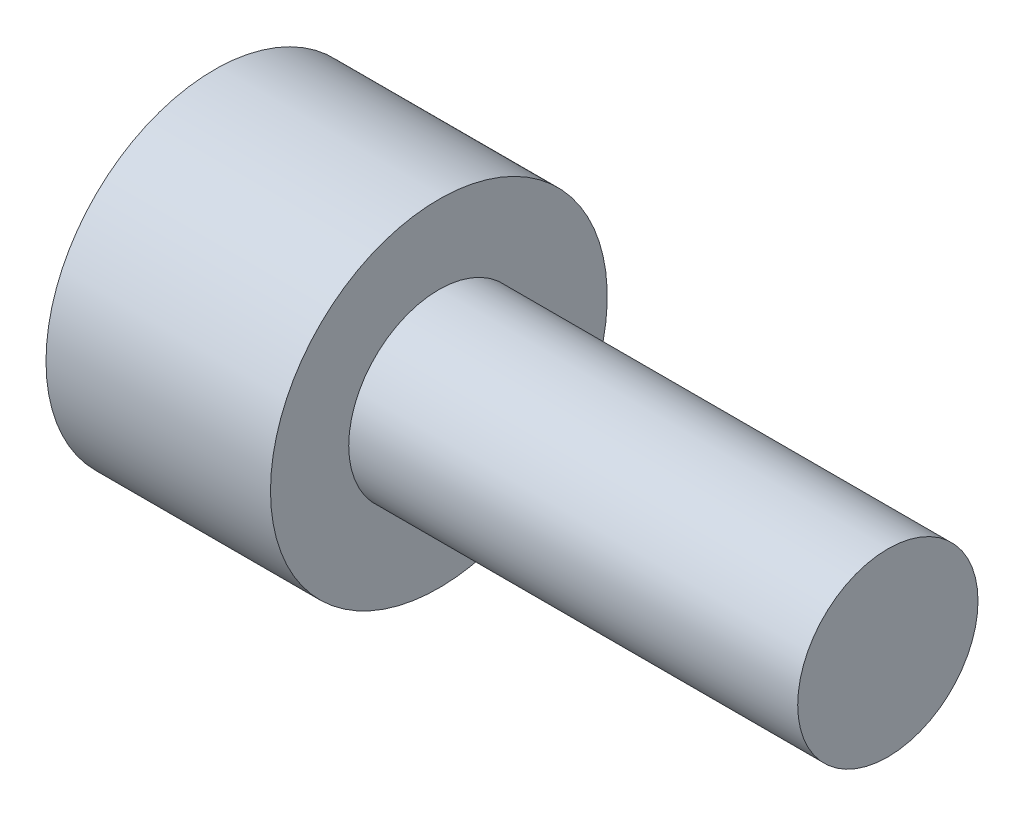
ISO-10303-21;
HEADER;
FILE_DESCRIPTION(('STEP AP214'),'2;1');
FILE_NAME('part.step','',(''),(''),'','','');
FILE_SCHEMA(('AUTOMOTIVE_DESIGN { 1 0 10303 214 1 1 1 1 }'));
ENDSEC;
DATA;
#1=APPLICATION_CONTEXT('core data for automotive mechanical design processes');
#2=APPLICATION_PROTOCOL_DEFINITION('international standard','automotive_design',2000,#1);
#3=PRODUCT_CONTEXT('',#1,'mechanical');
#4=PRODUCT('Part','Part','',(#3));
#5=PRODUCT_RELATED_PRODUCT_CATEGORY('part','',(#4));
#6=PRODUCT_DEFINITION_FORMATION('','',#4);
#7=PRODUCT_DEFINITION_CONTEXT('part definition',#1,'design');
#8=PRODUCT_DEFINITION('design','',#6,#7);
#9=PRODUCT_DEFINITION_SHAPE('','',#8);
#10=(LENGTH_UNIT() NAMED_UNIT(*) SI_UNIT(.MILLI.,.METRE.));
#11=(NAMED_UNIT(*) PLANE_ANGLE_UNIT() SI_UNIT($,.RADIAN.));
#12=(NAMED_UNIT(*) SI_UNIT($,.STERADIAN.) SOLID_ANGLE_UNIT());
#13=UNCERTAINTY_MEASURE_WITH_UNIT(LENGTH_MEASURE(1.E-05),#10,'distance_accuracy_value','');
#14=(GEOMETRIC_REPRESENTATION_CONTEXT(3) GLOBAL_UNCERTAINTY_ASSIGNED_CONTEXT((#13)) GLOBAL_UNIT_ASSIGNED_CONTEXT((#10,
#11,#12)) REPRESENTATION_CONTEXT('',''));
#15=CARTESIAN_POINT('',(0.,0.,0.));
#16=DIRECTION('',(0.,0.,1.));
#17=DIRECTION('',(1.,0.,0.));
#18=AXIS2_PLACEMENT_3D('',#15,#16,#17);
#19=CARTESIAN_POINT('',(-6.35,0.,0.));
#20=DIRECTION('',(1.,0.,0.));
#21=DIRECTION('',(0.,0.,-1.));
#22=AXIS2_PLACEMENT_3D('',#19,#20,#21);
#23=PLANE('',#22);
#24=CARTESIAN_POINT('',(-6.34999999999997,0.,0.));
#25=DIRECTION('',(-1.,0.,0.));
#26=DIRECTION('',(0.,0.,1.));
#27=AXIS2_PLACEMENT_3D('',#24,#25,#26);
#28=CIRCLE('',#27,4.7625);
#29=CARTESIAN_POINT('',(-6.34999999999997,0.,4.7625));
#30=VERTEX_POINT('',#29);
#31=EDGE_CURVE('E11',#30,#30,#28,.T.);
#32=ORIENTED_EDGE('',*,*,#31,.T.);
#33=EDGE_LOOP('',(#32));
#34=FACE_BOUND('',#33,.T.);
#35=DIRECTION('',(0.,0.866025403784439,-0.5));
#36=VECTOR('',#35,1.);
#37=CARTESIAN_POINT('',(-6.35,-2.38,-1.37409364067131));
#38=LINE('',#37,#36);
#39=CARTESIAN_POINT('',(-6.35,-2.38,-1.37409364067131));
#40=VERTEX_POINT('',#39);
#41=CARTESIAN_POINT('',(-6.35,0.,-2.74818728134262));
#42=VERTEX_POINT('',#41);
#43=EDGE_CURVE('E54',#40,#42,#38,.T.);
#44=ORIENTED_EDGE('',*,*,#43,.T.);
#45=DIRECTION('',(0.,0.866025403784439,0.5));
#46=VECTOR('',#45,1.);
#47=CARTESIAN_POINT('',(-6.35,0.,-2.74818728134262));
#48=LINE('',#47,#46);
#49=CARTESIAN_POINT('',(-6.35,2.38,-1.37409364067131));
#50=VERTEX_POINT('',#49);
#51=EDGE_CURVE('E127',#42,#50,#48,.T.);
#52=ORIENTED_EDGE('',*,*,#51,.T.);
#53=DIRECTION('',(0.,0.,1.));
#54=VECTOR('',#53,1.);
#55=CARTESIAN_POINT('',(-6.35,2.38,-1.37409364067131));
#56=LINE('',#55,#54);
#57=CARTESIAN_POINT('',(-6.35,2.38,1.37409364067131));
#58=VERTEX_POINT('',#57);
#59=EDGE_CURVE('E129',#50,#58,#56,.T.);
#60=ORIENTED_EDGE('',*,*,#59,.T.);
#61=DIRECTION('',(0.,-0.866025403784439,0.5));
#62=VECTOR('',#61,1.);
#63=CARTESIAN_POINT('',(-6.35,2.38,1.37409364067131));
#64=LINE('',#63,#62);
#65=CARTESIAN_POINT('',(-6.35,0.,2.74818728134262));
#66=VERTEX_POINT('',#65);
#67=EDGE_CURVE('E134',#58,#66,#64,.T.);
#68=ORIENTED_EDGE('',*,*,#67,.T.);
#69=DIRECTION('',(0.,-0.866025403784439,-0.5));
#70=VECTOR('',#69,1.);
#71=CARTESIAN_POINT('',(-6.35,0.,2.74818728134262));
#72=LINE('',#71,#70);
#73=CARTESIAN_POINT('',(-6.35,-2.38,1.37409364067131));
#74=VERTEX_POINT('',#73);
#75=EDGE_CURVE('E117',#66,#74,#72,.T.);
#76=ORIENTED_EDGE('',*,*,#75,.T.);
#77=DIRECTION('',(0.,0.,-1.));
#78=VECTOR('',#77,1.);
#79=CARTESIAN_POINT('',(-6.35,-2.38,1.37409364067131));
#80=LINE('',#79,#78);
#81=EDGE_CURVE('E133',#74,#40,#80,.T.);
#82=ORIENTED_EDGE('',*,*,#81,.T.);
#83=EDGE_LOOP('',(#44,#52,#60,#68,#76,#82));
#84=FACE_BOUND('',#83,.T.);
#85=ADVANCED_FACE('F41',(#34,#84),#23,.F.);
#86=CARTESIAN_POINT('',(-1000.,0.,0.));
#87=DIRECTION('',(-1.,0.,0.));
#88=DIRECTION('',(0.,0.,1.));
#89=AXIS2_PLACEMENT_3D('',#86,#87,#88);
#90=CYLINDRICAL_SURFACE('',#89,4.7625);
#91=ORIENTED_EDGE('',*,*,#31,.F.);
#92=EDGE_LOOP('',(#91));
#93=FACE_BOUND('',#92,.T.);
#94=CARTESIAN_POINT('',(0.,0.,0.));
#95=DIRECTION('',(-1.,0.,0.));
#96=DIRECTION('',(0.,0.,1.));
#97=AXIS2_PLACEMENT_3D('',#94,#95,#96);
#98=CIRCLE('',#97,4.7625);
#99=CARTESIAN_POINT('',(0.,0.,4.7625));
#100=VERTEX_POINT('',#99);
#101=EDGE_CURVE('E48',#100,#100,#98,.T.);
#102=ORIENTED_EDGE('',*,*,#101,.T.);
#103=EDGE_LOOP('',(#102));
#104=FACE_BOUND('',#103,.T.);
#105=ADVANCED_FACE('F152',(#93,#104),#90,.T.);
#106=CARTESIAN_POINT('',(0.,4.7625,0.));
#107=DIRECTION('',(-1.,0.,0.));
#108=DIRECTION('',(0.,0.,1.));
#109=AXIS2_PLACEMENT_3D('',#106,#107,#108);
#110=PLANE('',#109);
#111=ORIENTED_EDGE('',*,*,#101,.F.);
#112=EDGE_LOOP('',(#111));
#113=FACE_BOUND('',#112,.T.);
#114=CARTESIAN_POINT('',(0.,0.,0.));
#115=DIRECTION('',(-1.,0.,0.));
#116=DIRECTION('',(0.,0.,1.));
#117=AXIS2_PLACEMENT_3D('',#114,#115,#116);
#118=CIRCLE('',#117,2.55);
#119=CARTESIAN_POINT('',(0.,0.,2.55));
#120=VERTEX_POINT('',#119);
#121=EDGE_CURVE('E149',#120,#120,#118,.T.);
#122=ORIENTED_EDGE('',*,*,#121,.T.);
#123=EDGE_LOOP('',(#122));
#124=FACE_BOUND('',#123,.T.);
#125=ADVANCED_FACE('F156',(#113,#124),#110,.F.);
#126=CARTESIAN_POINT('',(-1000.,0.,0.));
#127=DIRECTION('',(-1.,0.,0.));
#128=DIRECTION('',(0.,0.,1.));
#129=AXIS2_PLACEMENT_3D('',#126,#127,#128);
#130=CYLINDRICAL_SURFACE('',#129,2.55);
#131=ORIENTED_EDGE('',*,*,#121,.F.);
#132=EDGE_LOOP('',(#131));
#133=FACE_BOUND('',#132,.T.);
#134=CARTESIAN_POINT('',(12.6999999999999,0.,0.));
#135=DIRECTION('',(-1.,0.,0.));
#136=DIRECTION('',(0.,0.,1.));
#137=AXIS2_PLACEMENT_3D('',#134,#135,#136);
#138=CIRCLE('',#137,2.55);
#139=CARTESIAN_POINT('',(12.6999999999999,0.,2.55));
#140=VERTEX_POINT('',#139);
#141=EDGE_CURVE('E148',#140,#140,#138,.T.);
#142=ORIENTED_EDGE('',*,*,#141,.T.);
#143=EDGE_LOOP('',(#142));
#144=FACE_BOUND('',#143,.T.);
#145=ADVANCED_FACE('F157',(#133,#144),#130,.T.);
#146=CARTESIAN_POINT('',(12.7,2.55,0.));
#147=DIRECTION('',(-1.,0.,0.));
#148=DIRECTION('',(0.,0.,1.));
#149=AXIS2_PLACEMENT_3D('',#146,#147,#148);
#150=PLANE('',#149);
#151=ORIENTED_EDGE('',*,*,#141,.F.);
#152=EDGE_LOOP('',(#151));
#153=FACE_BOUND('',#152,.T.);
#154=ADVANCED_FACE('F164',(#153),#150,.F.);
#155=CARTESIAN_POINT('',(-3.175,-2.38,-1.37409364067131));
#156=DIRECTION('',(0.,0.5,0.866025403784439));
#157=DIRECTION('',(0.,-0.866025403784439,0.5));
#158=AXIS2_PLACEMENT_3D('',#155,#156,#157);
#159=PLANE('',#158);
#160=ORIENTED_EDGE('',*,*,#43,.F.);
#161=DIRECTION('',(-1.,0.,0.));
#162=VECTOR('',#161,1.);
#163=CARTESIAN_POINT('',(-3.175,-2.38,-1.37409364067131));
#164=LINE('',#163,#162);
#165=CARTESIAN_POINT('',(-3.175,-2.38,-1.37409364067131));
#166=VERTEX_POINT('',#165);
#167=EDGE_CURVE('E123',#166,#40,#164,.T.);
#168=ORIENTED_EDGE('',*,*,#167,.F.);
#169=DIRECTION('',(0.,0.866025403784439,-0.5));
#170=VECTOR('',#169,1.);
#171=CARTESIAN_POINT('',(-3.175,-2.38,-1.37409364067131));
#172=LINE('',#171,#170);
#173=CARTESIAN_POINT('',(-3.175,0.,-2.74818728134262));
#174=VERTEX_POINT('',#173);
#175=EDGE_CURVE('E136',#166,#174,#172,.T.);
#176=ORIENTED_EDGE('',*,*,#175,.T.);
#177=DIRECTION('',(-1.,0.,0.));
#178=VECTOR('',#177,1.);
#179=CARTESIAN_POINT('',(-3.175,0.,-2.74818728134262));
#180=LINE('',#179,#178);
#181=EDGE_CURVE('E145',#174,#42,#180,.T.);
#182=ORIENTED_EDGE('',*,*,#181,.T.);
#183=EDGE_LOOP('',(#160,#168,#176,#182));
#184=FACE_BOUND('',#183,.T.);
#185=ADVANCED_FACE('F168',(#184),#159,.T.);
#186=CARTESIAN_POINT('',(-3.175,0.,-2.74818728134262));
#187=DIRECTION('',(0.,-0.5,0.866025403784439));
#188=DIRECTION('',(0.,-0.866025403784439,-0.5));
#189=AXIS2_PLACEMENT_3D('',#186,#187,#188);
#190=PLANE('',#189);
#191=ORIENTED_EDGE('',*,*,#51,.F.);
#192=ORIENTED_EDGE('',*,*,#181,.F.);
#193=DIRECTION('',(0.,0.866025403784439,0.5));
#194=VECTOR('',#193,1.);
#195=CARTESIAN_POINT('',(-3.175,0.,-2.74818728134262));
#196=LINE('',#195,#194);
#197=CARTESIAN_POINT('',(-3.175,2.38,-1.37409364067131));
#198=VERTEX_POINT('',#197);
#199=EDGE_CURVE('E94',#174,#198,#196,.T.);
#200=ORIENTED_EDGE('',*,*,#199,.T.);
#201=DIRECTION('',(-1.,0.,0.));
#202=VECTOR('',#201,1.);
#203=CARTESIAN_POINT('',(-3.175,2.38,-1.37409364067131));
#204=LINE('',#203,#202);
#205=EDGE_CURVE('E142',#198,#50,#204,.T.);
#206=ORIENTED_EDGE('',*,*,#205,.T.);
#207=EDGE_LOOP('',(#191,#192,#200,#206));
#208=FACE_BOUND('',#207,.T.);
#209=ADVANCED_FACE('F178',(#208),#190,.T.);
#210=CARTESIAN_POINT('',(-3.175,2.38,-1.37409364067131));
#211=DIRECTION('',(0.,-1.,0.));
#212=DIRECTION('',(0.,0.,-1.));
#213=AXIS2_PLACEMENT_3D('',#210,#211,#212);
#214=PLANE('',#213);
#215=ORIENTED_EDGE('',*,*,#59,.F.);
#216=ORIENTED_EDGE('',*,*,#205,.F.);
#217=DIRECTION('',(0.,0.,1.));
#218=VECTOR('',#217,1.);
#219=CARTESIAN_POINT('',(-3.175,2.38,-1.37409364067131));
#220=LINE('',#219,#218);
#221=CARTESIAN_POINT('',(-3.175,2.38,1.37409364067131));
#222=VERTEX_POINT('',#221);
#223=EDGE_CURVE('E115',#198,#222,#220,.T.);
#224=ORIENTED_EDGE('',*,*,#223,.T.);
#225=DIRECTION('',(-1.,0.,0.));
#226=VECTOR('',#225,1.);
#227=CARTESIAN_POINT('',(-3.175,2.38,1.37409364067131));
#228=LINE('',#227,#226);
#229=EDGE_CURVE('E108',#222,#58,#228,.T.);
#230=ORIENTED_EDGE('',*,*,#229,.T.);
#231=EDGE_LOOP('',(#215,#216,#224,#230));
#232=FACE_BOUND('',#231,.T.);
#233=ADVANCED_FACE('F195',(#232),#214,.T.);
#234=CARTESIAN_POINT('',(-3.175,2.38,1.37409364067131));
#235=DIRECTION('',(0.,-0.5,-0.866025403784438));
#236=DIRECTION('',(0.,0.866025403784439,-0.5));
#237=AXIS2_PLACEMENT_3D('',#234,#235,#236);
#238=PLANE('',#237);
#239=ORIENTED_EDGE('',*,*,#67,.F.);
#240=ORIENTED_EDGE('',*,*,#229,.F.);
#241=DIRECTION('',(0.,-0.866025403784439,0.5));
#242=VECTOR('',#241,1.);
#243=CARTESIAN_POINT('',(-3.175,2.38,1.37409364067131));
#244=LINE('',#243,#242);
#245=CARTESIAN_POINT('',(-3.175,0.,2.74818728134262));
#246=VERTEX_POINT('',#245);
#247=EDGE_CURVE('E102',#222,#246,#244,.T.);
#248=ORIENTED_EDGE('',*,*,#247,.T.);
#249=DIRECTION('',(-1.,0.,0.));
#250=VECTOR('',#249,1.);
#251=CARTESIAN_POINT('',(-3.175,0.,2.74818728134262));
#252=LINE('',#251,#250);
#253=EDGE_CURVE('E107',#246,#66,#252,.T.);
#254=ORIENTED_EDGE('',*,*,#253,.T.);
#255=EDGE_LOOP('',(#239,#240,#248,#254));
#256=FACE_BOUND('',#255,.T.);
#257=ADVANCED_FACE('F110',(#256),#238,.T.);
#258=CARTESIAN_POINT('',(-3.175,0.,2.74818728134262));
#259=DIRECTION('',(0.,0.5,-0.866025403784439));
#260=DIRECTION('',(0.,0.866025403784439,0.5));
#261=AXIS2_PLACEMENT_3D('',#258,#259,#260);
#262=PLANE('',#261);
#263=ORIENTED_EDGE('',*,*,#75,.F.);
#264=ORIENTED_EDGE('',*,*,#253,.F.);
#265=DIRECTION('',(0.,-0.866025403784439,-0.5));
#266=VECTOR('',#265,1.);
#267=CARTESIAN_POINT('',(-3.175,0.,2.74818728134262));
#268=LINE('',#267,#266);
#269=CARTESIAN_POINT('',(-3.175,-2.38,1.37409364067131));
#270=VERTEX_POINT('',#269);
#271=EDGE_CURVE('E112',#246,#270,#268,.T.);
#272=ORIENTED_EDGE('',*,*,#271,.T.);
#273=DIRECTION('',(-1.,0.,0.));
#274=VECTOR('',#273,1.);
#275=CARTESIAN_POINT('',(-3.175,-2.38,1.37409364067131));
#276=LINE('',#275,#274);
#277=EDGE_CURVE('E84',#270,#74,#276,.T.);
#278=ORIENTED_EDGE('',*,*,#277,.T.);
#279=EDGE_LOOP('',(#263,#264,#272,#278));
#280=FACE_BOUND('',#279,.T.);
#281=ADVANCED_FACE('F111',(#280),#262,.T.);
#282=CARTESIAN_POINT('',(-3.175,-2.38,1.37409364067131));
#283=DIRECTION('',(0.,1.,0.));
#284=DIRECTION('',(0.,0.,1.));
#285=AXIS2_PLACEMENT_3D('',#282,#283,#284);
#286=PLANE('',#285);
#287=ORIENTED_EDGE('',*,*,#81,.F.);
#288=ORIENTED_EDGE('',*,*,#277,.F.);
#289=DIRECTION('',(0.,0.,-1.));
#290=VECTOR('',#289,1.);
#291=CARTESIAN_POINT('',(-3.175,-2.38,1.37409364067131));
#292=LINE('',#291,#290);
#293=EDGE_CURVE('E65',#270,#166,#292,.T.);
#294=ORIENTED_EDGE('',*,*,#293,.T.);
#295=ORIENTED_EDGE('',*,*,#167,.T.);
#296=EDGE_LOOP('',(#287,#288,#294,#295));
#297=FACE_BOUND('',#296,.T.);
#298=ADVANCED_FACE('F183',(#297),#286,.T.);
#299=CARTESIAN_POINT('',(-3.175,0.,0.));
#300=DIRECTION('',(1.,0.,0.));
#301=DIRECTION('',(0.,0.,-1.));
#302=AXIS2_PLACEMENT_3D('',#299,#300,#301);
#303=PLANE('',#302);
#304=ORIENTED_EDGE('',*,*,#175,.F.);
#305=ORIENTED_EDGE('',*,*,#293,.F.);
#306=ORIENTED_EDGE('',*,*,#271,.F.);
#307=ORIENTED_EDGE('',*,*,#247,.F.);
#308=ORIENTED_EDGE('',*,*,#223,.F.);
#309=ORIENTED_EDGE('',*,*,#199,.F.);
#310=EDGE_LOOP('',(#304,#305,#306,#307,#308,#309));
#311=FACE_BOUND('',#310,.T.);
#312=ADVANCED_FACE('F116',(#311),#303,.F.);
#313=CLOSED_SHELL('',(#85,#105,#125,#145,#154,#185,#209,#233,#257,#281,#298,#312));
#314=MANIFOLD_SOLID_BREP('B2',#313);
#315=ADVANCED_BREP_SHAPE_REPRESENTATION('',(#18,#314),#14);
#316=SHAPE_DEFINITION_REPRESENTATION(#9,#315);
ENDSEC;
END-ISO-10303-21;
